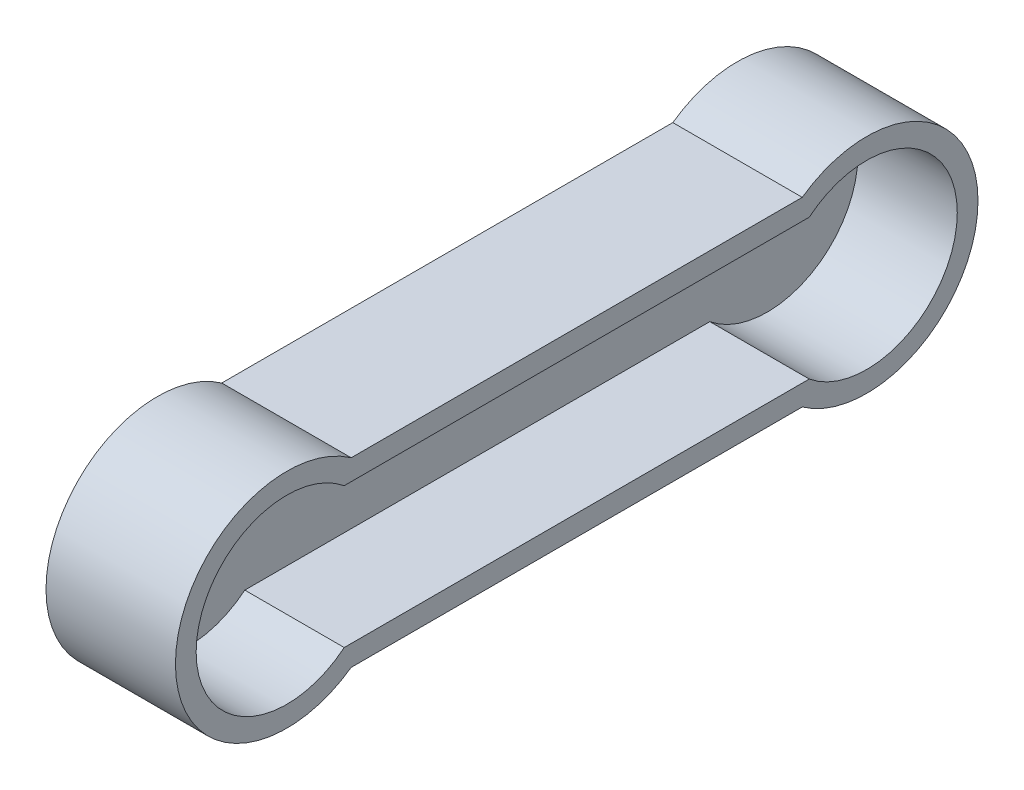
ISO-10303-21;
HEADER;
FILE_DESCRIPTION(('STEP AP214'),'2;1');
FILE_NAME('part.step','',(''),(''),'','','');
FILE_SCHEMA(('AUTOMOTIVE_DESIGN { 1 0 10303 214 1 1 1 1 }'));
ENDSEC;
DATA;
#1=APPLICATION_CONTEXT('core data for automotive mechanical design processes');
#2=APPLICATION_PROTOCOL_DEFINITION('international standard','automotive_design',2000,#1);
#3=PRODUCT_CONTEXT('',#1,'mechanical');
#4=PRODUCT('Part','Part','',(#3));
#5=PRODUCT_RELATED_PRODUCT_CATEGORY('part','',(#4));
#6=PRODUCT_DEFINITION_FORMATION('','',#4);
#7=PRODUCT_DEFINITION_CONTEXT('part definition',#1,'design');
#8=PRODUCT_DEFINITION('design','',#6,#7);
#9=PRODUCT_DEFINITION_SHAPE('','',#8);
#10=(LENGTH_UNIT() NAMED_UNIT(*) SI_UNIT(.MILLI.,.METRE.));
#11=(NAMED_UNIT(*) PLANE_ANGLE_UNIT() SI_UNIT($,.RADIAN.));
#12=(NAMED_UNIT(*) SI_UNIT($,.STERADIAN.) SOLID_ANGLE_UNIT());
#13=UNCERTAINTY_MEASURE_WITH_UNIT(LENGTH_MEASURE(1.E-05),#10,'distance_accuracy_value','');
#14=(GEOMETRIC_REPRESENTATION_CONTEXT(3) GLOBAL_UNCERTAINTY_ASSIGNED_CONTEXT((#13)) GLOBAL_UNIT_ASSIGNED_CONTEXT((#10,
#11,#12)) REPRESENTATION_CONTEXT('',''));
#15=CARTESIAN_POINT('',(0.,0.,0.));
#16=DIRECTION('',(0.,0.,1.));
#17=DIRECTION('',(1.,0.,0.));
#18=AXIS2_PLACEMENT_3D('',#15,#16,#17);
#19=CARTESIAN_POINT('',(12.5,0.,52.6944444444444));
#20=DIRECTION('',(-1.,0.,0.));
#21=DIRECTION('',(0.,0.,1.));
#22=AXIS2_PLACEMENT_3D('',#19,#20,#21);
#23=CYLINDRICAL_SURFACE('',#22,5.);
#24=CARTESIAN_POINT('',(-12.5,0.,52.6944444444444));
#25=DIRECTION('',(1.,0.,0.));
#26=DIRECTION('',(0.,0.,-1.));
#27=AXIS2_PLACEMENT_3D('',#24,#25,#26);
#28=CIRCLE('',#27,5.);
#29=CARTESIAN_POINT('',(-12.5,0.,47.6944444444444));
#30=VERTEX_POINT('',#29);
#31=EDGE_CURVE('E200',#30,#30,#28,.T.);
#32=ORIENTED_EDGE('',*,*,#31,.F.);
#33=EDGE_LOOP('',(#32));
#34=FACE_BOUND('',#33,.T.);
#35=CARTESIAN_POINT('',(-6.7,0.,52.6944444444444));
#36=DIRECTION('',(1.,0.,0.));
#37=DIRECTION('',(0.,0.,-1.));
#38=AXIS2_PLACEMENT_3D('',#35,#36,#37);
#39=CIRCLE('',#38,5.);
#40=CARTESIAN_POINT('',(-6.7,0.,47.6944444444444));
#41=VERTEX_POINT('',#40);
#42=EDGE_CURVE('E124',#41,#41,#39,.F.);
#43=ORIENTED_EDGE('',*,*,#42,.F.);
#44=EDGE_LOOP('',(#43));
#45=FACE_BOUND('',#44,.T.);
#46=ADVANCED_FACE('F41',(#34,#45),#23,.F.);
#47=CARTESIAN_POINT('',(12.5,0.,-59.3055555555556));
#48=DIRECTION('',(-1.,0.,0.));
#49=DIRECTION('',(0.,0.,1.));
#50=AXIS2_PLACEMENT_3D('',#47,#48,#49);
#51=CYLINDRICAL_SURFACE('',#50,5.);
#52=CARTESIAN_POINT('',(-12.5,0.,-59.3055555555556));
#53=DIRECTION('',(1.,0.,0.));
#54=DIRECTION('',(0.,0.,-1.));
#55=AXIS2_PLACEMENT_3D('',#52,#53,#54);
#56=CIRCLE('',#55,5.);
#57=CARTESIAN_POINT('',(-12.5,0.,-64.3055555555556));
#58=VERTEX_POINT('',#57);
#59=EDGE_CURVE('E178',#58,#58,#56,.T.);
#60=ORIENTED_EDGE('',*,*,#59,.F.);
#61=EDGE_LOOP('',(#60));
#62=FACE_BOUND('',#61,.T.);
#63=CARTESIAN_POINT('',(-6.7,0.,-59.3055555555556));
#64=DIRECTION('',(1.,0.,0.));
#65=DIRECTION('',(0.,0.,-1.));
#66=AXIS2_PLACEMENT_3D('',#63,#64,#65);
#67=CIRCLE('',#66,5.);
#68=CARTESIAN_POINT('',(-6.7,0.,-64.3055555555556));
#69=VERTEX_POINT('',#68);
#70=EDGE_CURVE('E151',#69,#69,#67,.F.);
#71=ORIENTED_EDGE('',*,*,#70,.F.);
#72=EDGE_LOOP('',(#71));
#73=FACE_BOUND('',#72,.T.);
#74=ADVANCED_FACE('F233',(#62,#73),#51,.F.);
#75=CARTESIAN_POINT('',(12.5,0.,52.6944444444444));
#76=DIRECTION('',(-1.,0.,0.));
#77=DIRECTION('',(0.,0.,1.));
#78=AXIS2_PLACEMENT_3D('',#75,#76,#77);
#79=CYLINDRICAL_SURFACE('',#78,21.5);
#80=CARTESIAN_POINT('',(-12.5,0.,52.6944444444444));
#81=DIRECTION('',(1.,0.,0.));
#82=DIRECTION('',(0.,0.,-1.));
#83=AXIS2_PLACEMENT_3D('',#80,#81,#82);
#84=CIRCLE('',#83,21.5);
#85=CARTESIAN_POINT('',(-12.5,17.5334036118072,40.2513838167103));
#86=VERTEX_POINT('',#85);
#87=CARTESIAN_POINT('',(-12.5,-17.5334036118072,40.2513838167103));
#88=VERTEX_POINT('',#87);
#89=EDGE_CURVE('E169',#86,#88,#84,.T.);
#90=ORIENTED_EDGE('',*,*,#89,.T.);
#91=DIRECTION('',(-1.,0.,0.));
#92=VECTOR('',#91,1.);
#93=CARTESIAN_POINT('',(12.5,-17.5334036118072,40.2513838167103));
#94=LINE('',#93,#92);
#95=CARTESIAN_POINT('',(12.5,-17.5334036118072,40.2513838167103));
#96=VERTEX_POINT('',#95);
#97=EDGE_CURVE('E11',#96,#88,#94,.T.);
#98=ORIENTED_EDGE('',*,*,#97,.F.);
#99=CARTESIAN_POINT('',(12.5,0.,52.6944444444444));
#100=DIRECTION('',(1.,0.,0.));
#101=DIRECTION('',(0.,0.,-1.));
#102=AXIS2_PLACEMENT_3D('',#99,#100,#101);
#103=CIRCLE('',#102,21.5);
#104=CARTESIAN_POINT('',(12.5,17.5334036118072,40.2513838167103));
#105=VERTEX_POINT('',#104);
#106=EDGE_CURVE('E175',#105,#96,#103,.T.);
#107=ORIENTED_EDGE('',*,*,#106,.F.);
#108=DIRECTION('',(-1.,0.,0.));
#109=VECTOR('',#108,1.);
#110=CARTESIAN_POINT('',(12.5,17.5334036118072,40.2513838167103));
#111=LINE('',#110,#109);
#112=EDGE_CURVE('E66',#105,#86,#111,.T.);
#113=ORIENTED_EDGE('',*,*,#112,.T.);
#114=EDGE_LOOP('',(#90,#98,#107,#113));
#115=FACE_BOUND('',#114,.T.);
#116=ADVANCED_FACE('F43',(#115),#79,.T.);
#117=CARTESIAN_POINT('',(12.5,-17.5334036118072,0.));
#118=DIRECTION('',(0.,1.,0.));
#119=DIRECTION('',(0.,0.,1.));
#120=AXIS2_PLACEMENT_3D('',#117,#118,#119);
#121=PLANE('',#120);
#122=DIRECTION('',(0.,0.,-1.));
#123=VECTOR('',#122,1.);
#124=CARTESIAN_POINT('',(-12.5,-17.5334036118072,0.));
#125=LINE('',#124,#123);
#126=CARTESIAN_POINT('',(-12.5,-17.5334036118072,-46.8624949278214));
#127=VERTEX_POINT('',#126);
#128=EDGE_CURVE('E189',#88,#127,#125,.T.);
#129=ORIENTED_EDGE('',*,*,#128,.T.);
#130=DIRECTION('',(-1.,0.,0.));
#131=VECTOR('',#130,1.);
#132=CARTESIAN_POINT('',(12.5,-17.5334036118072,-46.8624949278214));
#133=LINE('',#132,#131);
#134=CARTESIAN_POINT('',(12.5,-17.5334036118072,-46.8624949278214));
#135=VERTEX_POINT('',#134);
#136=EDGE_CURVE('E50',#135,#127,#133,.T.);
#137=ORIENTED_EDGE('',*,*,#136,.F.);
#138=DIRECTION('',(0.,0.,-1.));
#139=VECTOR('',#138,1.);
#140=CARTESIAN_POINT('',(12.5,-17.5334036118072,0.));
#141=LINE('',#140,#139);
#142=EDGE_CURVE('E92',#96,#135,#141,.T.);
#143=ORIENTED_EDGE('',*,*,#142,.F.);
#144=ORIENTED_EDGE('',*,*,#97,.T.);
#145=EDGE_LOOP('',(#129,#137,#143,#144));
#146=FACE_BOUND('',#145,.T.);
#147=ADVANCED_FACE('F226',(#146),#121,.F.);
#148=CARTESIAN_POINT('',(12.5,0.,-59.3055555555556));
#149=DIRECTION('',(-1.,0.,0.));
#150=DIRECTION('',(0.,0.,1.));
#151=AXIS2_PLACEMENT_3D('',#148,#149,#150);
#152=CYLINDRICAL_SURFACE('',#151,21.5);
#153=CARTESIAN_POINT('',(-12.5,0.,-59.3055555555556));
#154=DIRECTION('',(1.,0.,0.));
#155=DIRECTION('',(0.,0.,-1.));
#156=AXIS2_PLACEMENT_3D('',#153,#154,#155);
#157=CIRCLE('',#156,21.5);
#158=CARTESIAN_POINT('',(-12.5,17.5334036118072,-46.8624949278214));
#159=VERTEX_POINT('',#158);
#160=EDGE_CURVE('E192',#127,#159,#157,.T.);
#161=ORIENTED_EDGE('',*,*,#160,.T.);
#162=DIRECTION('',(-1.,0.,0.));
#163=VECTOR('',#162,1.);
#164=CARTESIAN_POINT('',(12.5,17.5334036118072,-46.8624949278214));
#165=LINE('',#164,#163);
#166=CARTESIAN_POINT('',(12.5,17.5334036118072,-46.8624949278214));
#167=VERTEX_POINT('',#166);
#168=EDGE_CURVE('E209',#167,#159,#165,.T.);
#169=ORIENTED_EDGE('',*,*,#168,.F.);
#170=CARTESIAN_POINT('',(12.5,0.,-59.3055555555556));
#171=DIRECTION('',(1.,0.,0.));
#172=DIRECTION('',(0.,0.,-1.));
#173=AXIS2_PLACEMENT_3D('',#170,#171,#172);
#174=CIRCLE('',#173,21.5);
#175=EDGE_CURVE('E181',#135,#167,#174,.T.);
#176=ORIENTED_EDGE('',*,*,#175,.F.);
#177=ORIENTED_EDGE('',*,*,#136,.T.);
#178=EDGE_LOOP('',(#161,#169,#176,#177));
#179=FACE_BOUND('',#178,.T.);
#180=ADVANCED_FACE('F216',(#179),#152,.T.);
#181=CARTESIAN_POINT('',(12.5,17.5334036118072,0.));
#182=DIRECTION('',(0.,1.,0.));
#183=DIRECTION('',(0.,0.,1.));
#184=AXIS2_PLACEMENT_3D('',#181,#182,#183);
#185=PLANE('',#184);
#186=DIRECTION('',(0.,0.,-1.));
#187=VECTOR('',#186,1.);
#188=CARTESIAN_POINT('',(-12.5,17.5334036118072,0.));
#189=LINE('',#188,#187);
#190=EDGE_CURVE('E196',#86,#159,#189,.T.);
#191=ORIENTED_EDGE('',*,*,#190,.F.);
#192=ORIENTED_EDGE('',*,*,#112,.F.);
#193=DIRECTION('',(0.,0.,-1.));
#194=VECTOR('',#193,1.);
#195=CARTESIAN_POINT('',(12.5,17.5334036118072,0.));
#196=LINE('',#195,#194);
#197=EDGE_CURVE('E184',#105,#167,#196,.T.);
#198=ORIENTED_EDGE('',*,*,#197,.T.);
#199=ORIENTED_EDGE('',*,*,#168,.T.);
#200=EDGE_LOOP('',(#191,#192,#198,#199));
#201=FACE_BOUND('',#200,.T.);
#202=ADVANCED_FACE('F221',(#201),#185,.T.);
#203=CARTESIAN_POINT('',(12.5,0.,0.));
#204=DIRECTION('',(1.,0.,0.));
#205=DIRECTION('',(0.,0.,-1.));
#206=AXIS2_PLACEMENT_3D('',#203,#204,#205);
#207=PLANE('',#206);
#208=DIRECTION('',(0.,0.,-1.));
#209=VECTOR('',#208,1.);
#210=CARTESIAN_POINT('',(12.5,-13.5334036118072,0.));
#211=LINE('',#210,#209);
#212=CARTESIAN_POINT('',(12.5,-13.5334036118072,41.5995363024216));
#213=VERTEX_POINT('',#212);
#214=CARTESIAN_POINT('',(12.5,-13.5334036118072,-48.2106474135327));
#215=VERTEX_POINT('',#214);
#216=EDGE_CURVE('E57',#213,#215,#211,.T.);
#217=ORIENTED_EDGE('',*,*,#216,.F.);
#218=CARTESIAN_POINT('',(12.5,0.,52.6944444444444));
#219=DIRECTION('',(1.,0.,0.));
#220=DIRECTION('',(0.,0.,-1.));
#221=AXIS2_PLACEMENT_3D('',#218,#219,#220);
#222=CIRCLE('',#221,17.5);
#223=CARTESIAN_POINT('',(12.5,13.5334036118072,41.5995363024216));
#224=VERTEX_POINT('',#223);
#225=EDGE_CURVE('E140',#224,#213,#222,.T.);
#226=ORIENTED_EDGE('',*,*,#225,.F.);
#227=DIRECTION('',(0.,0.,-1.));
#228=VECTOR('',#227,1.);
#229=CARTESIAN_POINT('',(12.5,13.5334036118072,0.));
#230=LINE('',#229,#228);
#231=CARTESIAN_POINT('',(12.5,13.5334036118072,-48.2106474135327));
#232=VERTEX_POINT('',#231);
#233=EDGE_CURVE('E144',#224,#232,#230,.T.);
#234=ORIENTED_EDGE('',*,*,#233,.T.);
#235=CARTESIAN_POINT('',(12.5,0.,-59.3055555555556));
#236=DIRECTION('',(1.,0.,0.));
#237=DIRECTION('',(0.,0.,-1.));
#238=AXIS2_PLACEMENT_3D('',#235,#236,#237);
#239=CIRCLE('',#238,17.5);
#240=EDGE_CURVE('E160',#215,#232,#239,.T.);
#241=ORIENTED_EDGE('',*,*,#240,.F.);
#242=EDGE_LOOP('',(#217,#226,#234,#241));
#243=FACE_BOUND('',#242,.T.);
#244=ORIENTED_EDGE('',*,*,#106,.T.);
#245=ORIENTED_EDGE('',*,*,#142,.T.);
#246=ORIENTED_EDGE('',*,*,#175,.T.);
#247=ORIENTED_EDGE('',*,*,#197,.F.);
#248=EDGE_LOOP('',(#244,#245,#246,#247));
#249=FACE_BOUND('',#248,.T.);
#250=ADVANCED_FACE('F224',(#243,#249),#207,.T.);
#251=CARTESIAN_POINT('',(-12.5,0.,0.));
#252=DIRECTION('',(1.,0.,0.));
#253=DIRECTION('',(0.,0.,-1.));
#254=AXIS2_PLACEMENT_3D('',#251,#252,#253);
#255=PLANE('',#254);
#256=ORIENTED_EDGE('',*,*,#89,.F.);
#257=ORIENTED_EDGE('',*,*,#190,.T.);
#258=ORIENTED_EDGE('',*,*,#160,.F.);
#259=ORIENTED_EDGE('',*,*,#128,.F.);
#260=EDGE_LOOP('',(#256,#257,#258,#259));
#261=FACE_BOUND('',#260,.T.);
#262=ORIENTED_EDGE('',*,*,#31,.T.);
#263=EDGE_LOOP('',(#262));
#264=FACE_BOUND('',#263,.T.);
#265=ORIENTED_EDGE('',*,*,#59,.T.);
#266=EDGE_LOOP('',(#265));
#267=FACE_BOUND('',#266,.T.);
#268=ADVANCED_FACE('F219',(#261,#264,#267),#255,.F.);
#269=CARTESIAN_POINT('',(-6.7,-13.5334036118072,0.));
#270=DIRECTION('',(0.,-1.,0.));
#271=DIRECTION('',(0.,0.,-1.));
#272=AXIS2_PLACEMENT_3D('',#269,#270,#271);
#273=PLANE('',#272);
#274=ORIENTED_EDGE('',*,*,#216,.T.);
#275=DIRECTION('',(1.,0.,0.));
#276=VECTOR('',#275,1.);
#277=CARTESIAN_POINT('',(-6.7,-13.5334036118072,-48.2106474135327));
#278=LINE('',#277,#276);
#279=CARTESIAN_POINT('',(-6.7,-13.5334036118072,-48.2106474135327));
#280=VERTEX_POINT('',#279);
#281=EDGE_CURVE('E113',#280,#215,#278,.T.);
#282=ORIENTED_EDGE('',*,*,#281,.F.);
#283=DIRECTION('',(0.,0.,-1.));
#284=VECTOR('',#283,1.);
#285=CARTESIAN_POINT('',(-6.7,-13.5334036118072,0.));
#286=LINE('',#285,#284);
#287=CARTESIAN_POINT('',(-6.7,-13.5334036118072,41.5995363024216));
#288=VERTEX_POINT('',#287);
#289=EDGE_CURVE('E117',#288,#280,#286,.T.);
#290=ORIENTED_EDGE('',*,*,#289,.F.);
#291=DIRECTION('',(1.,0.,0.));
#292=VECTOR('',#291,1.);
#293=CARTESIAN_POINT('',(-6.7,-13.5334036118072,41.5995363024216));
#294=LINE('',#293,#292);
#295=EDGE_CURVE('E166',#288,#213,#294,.T.);
#296=ORIENTED_EDGE('',*,*,#295,.T.);
#297=EDGE_LOOP('',(#274,#282,#290,#296));
#298=FACE_BOUND('',#297,.T.);
#299=ADVANCED_FACE('F115',(#298),#273,.F.);
#300=CARTESIAN_POINT('',(-6.7,0.,52.6944444444444));
#301=DIRECTION('',(1.,0.,0.));
#302=DIRECTION('',(0.,0.,-1.));
#303=AXIS2_PLACEMENT_3D('',#300,#301,#302);
#304=CYLINDRICAL_SURFACE('',#303,17.5);
#305=ORIENTED_EDGE('',*,*,#225,.T.);
#306=ORIENTED_EDGE('',*,*,#295,.F.);
#307=CARTESIAN_POINT('',(-6.7,0.,52.6944444444444));
#308=DIRECTION('',(1.,0.,0.));
#309=DIRECTION('',(0.,0.,-1.));
#310=AXIS2_PLACEMENT_3D('',#307,#308,#309);
#311=CIRCLE('',#310,17.5);
#312=CARTESIAN_POINT('',(-6.7,13.5334036118072,41.5995363024216));
#313=VERTEX_POINT('',#312);
#314=EDGE_CURVE('E138',#313,#288,#311,.T.);
#315=ORIENTED_EDGE('',*,*,#314,.F.);
#316=DIRECTION('',(1.,0.,0.));
#317=VECTOR('',#316,1.);
#318=CARTESIAN_POINT('',(-6.7,13.5334036118072,41.5995363024216));
#319=LINE('',#318,#317);
#320=EDGE_CURVE('E170',#313,#224,#319,.T.);
#321=ORIENTED_EDGE('',*,*,#320,.T.);
#322=EDGE_LOOP('',(#305,#306,#315,#321));
#323=FACE_BOUND('',#322,.T.);
#324=ADVANCED_FACE('F258',(#323),#304,.F.);
#325=CARTESIAN_POINT('',(-6.7,13.5334036118072,0.));
#326=DIRECTION('',(0.,-1.,0.));
#327=DIRECTION('',(0.,0.,-1.));
#328=AXIS2_PLACEMENT_3D('',#325,#326,#327);
#329=PLANE('',#328);
#330=ORIENTED_EDGE('',*,*,#233,.F.);
#331=ORIENTED_EDGE('',*,*,#320,.F.);
#332=DIRECTION('',(0.,0.,-1.));
#333=VECTOR('',#332,1.);
#334=CARTESIAN_POINT('',(-6.7,13.5334036118072,0.));
#335=LINE('',#334,#333);
#336=CARTESIAN_POINT('',(-6.7,13.5334036118072,-48.2106474135327));
#337=VERTEX_POINT('',#336);
#338=EDGE_CURVE('E133',#313,#337,#335,.T.);
#339=ORIENTED_EDGE('',*,*,#338,.T.);
#340=DIRECTION('',(1.,0.,0.));
#341=VECTOR('',#340,1.);
#342=CARTESIAN_POINT('',(-6.7,13.5334036118072,-48.2106474135327));
#343=LINE('',#342,#341);
#344=EDGE_CURVE('E123',#337,#232,#343,.T.);
#345=ORIENTED_EDGE('',*,*,#344,.T.);
#346=EDGE_LOOP('',(#330,#331,#339,#345));
#347=FACE_BOUND('',#346,.T.);
#348=ADVANCED_FACE('F261',(#347),#329,.T.);
#349=CARTESIAN_POINT('',(-6.7,0.,-59.3055555555556));
#350=DIRECTION('',(1.,0.,0.));
#351=DIRECTION('',(0.,0.,-1.));
#352=AXIS2_PLACEMENT_3D('',#349,#350,#351);
#353=CYLINDRICAL_SURFACE('',#352,17.5);
#354=ORIENTED_EDGE('',*,*,#240,.T.);
#355=ORIENTED_EDGE('',*,*,#344,.F.);
#356=CARTESIAN_POINT('',(-6.7,0.,-59.3055555555556));
#357=DIRECTION('',(1.,0.,0.));
#358=DIRECTION('',(0.,0.,-1.));
#359=AXIS2_PLACEMENT_3D('',#356,#357,#358);
#360=CIRCLE('',#359,17.5);
#361=EDGE_CURVE('E128',#280,#337,#360,.T.);
#362=ORIENTED_EDGE('',*,*,#361,.F.);
#363=ORIENTED_EDGE('',*,*,#281,.T.);
#364=EDGE_LOOP('',(#354,#355,#362,#363));
#365=FACE_BOUND('',#364,.T.);
#366=ADVANCED_FACE('F129',(#365),#353,.F.);
#367=CARTESIAN_POINT('',(-6.7,0.,0.));
#368=DIRECTION('',(1.,0.,0.));
#369=DIRECTION('',(0.,0.,-1.));
#370=AXIS2_PLACEMENT_3D('',#367,#368,#369);
#371=PLANE('',#370);
#372=ORIENTED_EDGE('',*,*,#289,.T.);
#373=ORIENTED_EDGE('',*,*,#361,.T.);
#374=ORIENTED_EDGE('',*,*,#338,.F.);
#375=ORIENTED_EDGE('',*,*,#314,.T.);
#376=EDGE_LOOP('',(#372,#373,#374,#375));
#377=FACE_BOUND('',#376,.T.);
#378=ORIENTED_EDGE('',*,*,#70,.T.);
#379=EDGE_LOOP('',(#378));
#380=FACE_BOUND('',#379,.T.);
#381=ORIENTED_EDGE('',*,*,#42,.T.);
#382=EDGE_LOOP('',(#381));
#383=FACE_BOUND('',#382,.T.);
#384=ADVANCED_FACE('F135',(#377,#380,#383),#371,.T.);
#385=CLOSED_SHELL('',(#46,#74,#116,#147,#180,#202,#250,#268,#299,#324,#348,#366,#384));
#386=MANIFOLD_SOLID_BREP('B2',#385);
#387=ADVANCED_BREP_SHAPE_REPRESENTATION('',(#18,#386),#14);
#388=SHAPE_DEFINITION_REPRESENTATION(#9,#387);
ENDSEC;
END-ISO-10303-21;
